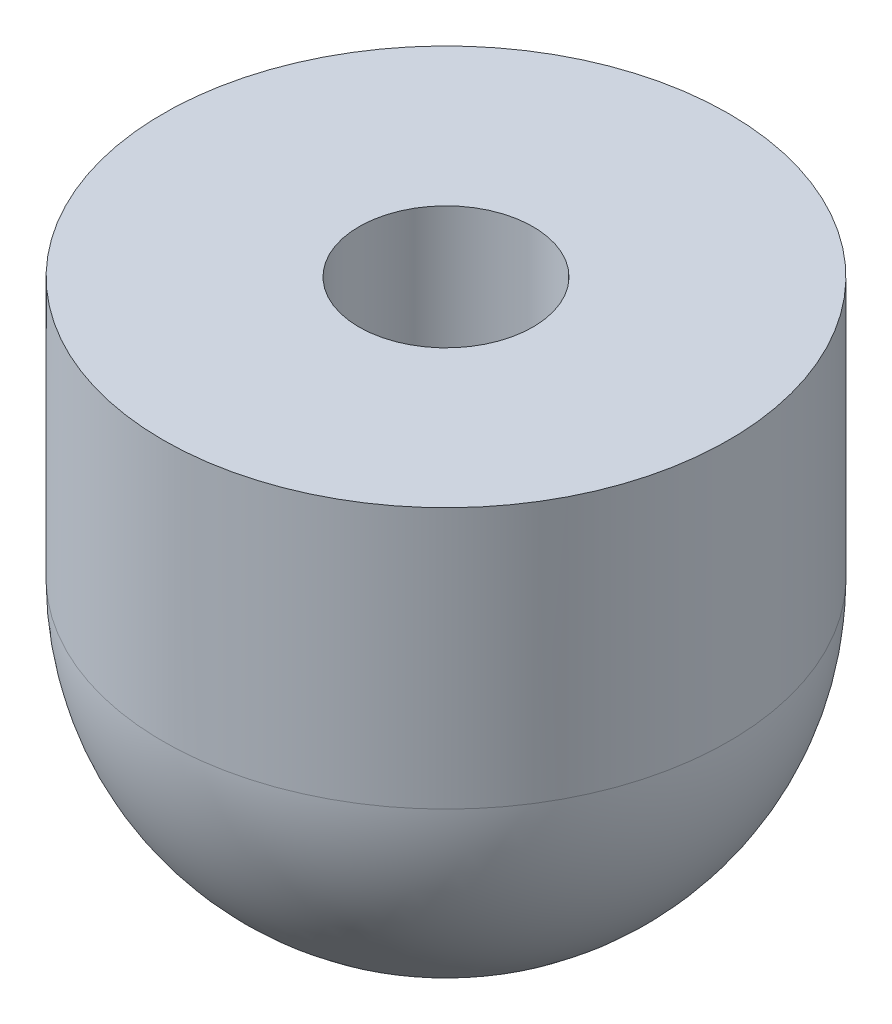
ISO-10303-21;
HEADER;
FILE_DESCRIPTION(('STEP AP214'),'2;1');
FILE_NAME('part.step','',(''),(''),'','','');
FILE_SCHEMA(('AUTOMOTIVE_DESIGN { 1 0 10303 214 1 1 1 1 }'));
ENDSEC;
DATA;
#1=APPLICATION_CONTEXT('core data for automotive mechanical design processes');
#2=APPLICATION_PROTOCOL_DEFINITION('international standard','automotive_design',2000,#1);
#3=PRODUCT_CONTEXT('',#1,'mechanical');
#4=PRODUCT('Part','Part','',(#3));
#5=PRODUCT_RELATED_PRODUCT_CATEGORY('part','',(#4));
#6=PRODUCT_DEFINITION_FORMATION('','',#4);
#7=PRODUCT_DEFINITION_CONTEXT('part definition',#1,'design');
#8=PRODUCT_DEFINITION('design','',#6,#7);
#9=PRODUCT_DEFINITION_SHAPE('','',#8);
#10=(LENGTH_UNIT() NAMED_UNIT(*) SI_UNIT(.MILLI.,.METRE.));
#11=(NAMED_UNIT(*) PLANE_ANGLE_UNIT() SI_UNIT($,.RADIAN.));
#12=(NAMED_UNIT(*) SI_UNIT($,.STERADIAN.) SOLID_ANGLE_UNIT());
#13=UNCERTAINTY_MEASURE_WITH_UNIT(LENGTH_MEASURE(1.E-05),#10,'distance_accuracy_value','');
#14=(GEOMETRIC_REPRESENTATION_CONTEXT(3) GLOBAL_UNCERTAINTY_ASSIGNED_CONTEXT((#13)) GLOBAL_UNIT_ASSIGNED_CONTEXT((#10,
#11,#12)) REPRESENTATION_CONTEXT('',''));
#15=CARTESIAN_POINT('',(0.,0.,0.));
#16=DIRECTION('',(0.,0.,1.));
#17=DIRECTION('',(1.,0.,0.));
#18=AXIS2_PLACEMENT_3D('',#15,#16,#17);
#19=CARTESIAN_POINT('',(0.,25.,0.));
#20=DIRECTION('',(0.,-1.,0.));
#21=DIRECTION('',(0.,0.,-1.));
#22=AXIS2_PLACEMENT_3D('',#19,#20,#21);
#23=CYLINDRICAL_SURFACE('',#22,13.);
#24=CARTESIAN_POINT('',(0.,25.,0.));
#25=DIRECTION('',(0.,1.,0.));
#26=DIRECTION('',(0.,0.,1.));
#27=AXIS2_PLACEMENT_3D('',#24,#25,#26);
#28=CIRCLE('',#27,13.);
#29=CARTESIAN_POINT('',(0.,25.,13.));
#30=VERTEX_POINT('',#29);
#31=EDGE_CURVE('E11',#30,#30,#28,.T.);
#32=ORIENTED_EDGE('',*,*,#31,.F.);
#33=EDGE_LOOP('',(#32));
#34=FACE_BOUND('',#33,.T.);
#35=CARTESIAN_POINT('',(0.,13.,0.));
#36=DIRECTION('',(0.,-1.,0.));
#37=DIRECTION('',(0.,0.,-1.));
#38=AXIS2_PLACEMENT_3D('',#35,#36,#37);
#39=CIRCLE('',#38,13.);
#40=CARTESIAN_POINT('',(0.,13.,-13.));
#41=VERTEX_POINT('',#40);
#42=EDGE_CURVE('E48',#41,#41,#39,.T.);
#43=ORIENTED_EDGE('',*,*,#42,.F.);
#44=EDGE_LOOP('',(#43));
#45=FACE_BOUND('',#44,.T.);
#46=ADVANCED_FACE('F32',(#34,#45),#23,.T.);
#47=CARTESIAN_POINT('',(0.,25.,0.));
#48=DIRECTION('',(0.,1.,0.));
#49=DIRECTION('',(0.,0.,1.));
#50=AXIS2_PLACEMENT_3D('',#47,#48,#49);
#51=PLANE('',#50);
#52=CARTESIAN_POINT('',(0.,25.,0.));
#53=DIRECTION('',(0.,1.,0.));
#54=DIRECTION('',(0.,0.,1.));
#55=AXIS2_PLACEMENT_3D('',#52,#53,#54);
#56=CIRCLE('',#55,4.);
#57=CARTESIAN_POINT('',(0.,25.,4.));
#58=VERTEX_POINT('',#57);
#59=EDGE_CURVE('E50',#58,#58,#56,.T.);
#60=ORIENTED_EDGE('',*,*,#59,.F.);
#61=EDGE_LOOP('',(#60));
#62=FACE_BOUND('',#61,.T.);
#63=ORIENTED_EDGE('',*,*,#31,.T.);
#64=EDGE_LOOP('',(#63));
#65=FACE_BOUND('',#64,.T.);
#66=ADVANCED_FACE('F61',(#62,#65),#51,.T.);
#67=CARTESIAN_POINT('',(0.,17.,0.));
#68=DIRECTION('',(0.,1.,0.));
#69=DIRECTION('',(0.,0.,1.));
#70=AXIS2_PLACEMENT_3D('',#67,#68,#69);
#71=CYLINDRICAL_SURFACE('',#70,4.);
#72=CARTESIAN_POINT('',(0.,17.,0.));
#73=DIRECTION('',(0.,1.,0.));
#74=DIRECTION('',(0.,0.,1.));
#75=AXIS2_PLACEMENT_3D('',#72,#73,#74);
#76=CIRCLE('',#75,4.);
#77=CARTESIAN_POINT('',(0.,17.,4.));
#78=VERTEX_POINT('',#77);
#79=EDGE_CURVE('E38',#78,#78,#76,.T.);
#80=ORIENTED_EDGE('',*,*,#79,.F.);
#81=EDGE_LOOP('',(#80));
#82=FACE_BOUND('',#81,.T.);
#83=ORIENTED_EDGE('',*,*,#59,.T.);
#84=EDGE_LOOP('',(#83));
#85=FACE_BOUND('',#84,.T.);
#86=ADVANCED_FACE('F58',(#82,#85),#71,.F.);
#87=CARTESIAN_POINT('',(0.,17.,0.));
#88=DIRECTION('',(0.,1.,0.));
#89=DIRECTION('',(0.,0.,1.));
#90=AXIS2_PLACEMENT_3D('',#87,#88,#89);
#91=PLANE('',#90);
#92=ORIENTED_EDGE('',*,*,#79,.T.);
#93=EDGE_LOOP('',(#92));
#94=FACE_BOUND('',#93,.T.);
#95=ADVANCED_FACE('F44',(#94),#91,.T.);
#96=CARTESIAN_POINT('',(0.,13.,0.));
#97=DIRECTION('',(0.,-1.,0.));
#98=DIRECTION('',(-1.,0.,0.));
#99=AXIS2_PLACEMENT_3D('',#96,#97,#98);
#100=SPHERICAL_SURFACE('',#99,13.);
#101=CARTESIAN_POINT('',(0.,0.,0.));
#102=VERTEX_POINT('',#101);
#103=VERTEX_LOOP('',#102);
#104=FACE_BOUND('',#103,.T.);
#105=ORIENTED_EDGE('',*,*,#42,.T.);
#106=EDGE_LOOP('',(#105));
#107=FACE_BOUND('',#106,.T.);
#108=ADVANCED_FACE('F41',(#104,#107),#100,.T.);
#109=CLOSED_SHELL('',(#46,#66,#86,#95,#108));
#110=MANIFOLD_SOLID_BREP('B2',#109);
#111=ADVANCED_BREP_SHAPE_REPRESENTATION('',(#18,#110),#14);
#112=SHAPE_DEFINITION_REPRESENTATION(#9,#111);
ENDSEC;
END-ISO-10303-21;
